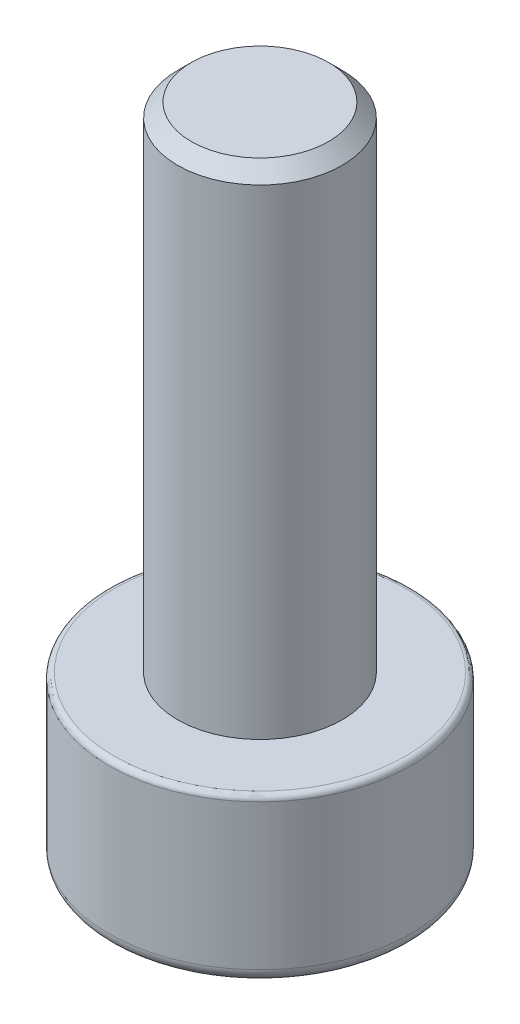
ISO-10303-21;
HEADER;
FILE_DESCRIPTION(('STEP AP214'),'2;1');
FILE_NAME('part.step','',(''),(''),'','','');
FILE_SCHEMA(('AUTOMOTIVE_DESIGN { 1 0 10303 214 1 1 1 1 }'));
ENDSEC;
DATA;
#1=APPLICATION_CONTEXT('core data for automotive mechanical design processes');
#2=APPLICATION_PROTOCOL_DEFINITION('international standard','automotive_design',2000,#1);
#3=PRODUCT_CONTEXT('',#1,'mechanical');
#4=PRODUCT('Part','Part','',(#3));
#5=PRODUCT_RELATED_PRODUCT_CATEGORY('part','',(#4));
#6=PRODUCT_DEFINITION_FORMATION('','',#4);
#7=PRODUCT_DEFINITION_CONTEXT('part definition',#1,'design');
#8=PRODUCT_DEFINITION('design','',#6,#7);
#9=PRODUCT_DEFINITION_SHAPE('','',#8);
#10=(LENGTH_UNIT() NAMED_UNIT(*) SI_UNIT(.MILLI.,.METRE.));
#11=(NAMED_UNIT(*) PLANE_ANGLE_UNIT() SI_UNIT($,.RADIAN.));
#12=(NAMED_UNIT(*) SI_UNIT($,.STERADIAN.) SOLID_ANGLE_UNIT());
#13=UNCERTAINTY_MEASURE_WITH_UNIT(LENGTH_MEASURE(1.E-05),#10,'distance_accuracy_value','');
#14=(GEOMETRIC_REPRESENTATION_CONTEXT(3) GLOBAL_UNCERTAINTY_ASSIGNED_CONTEXT((#13)) GLOBAL_UNIT_ASSIGNED_CONTEXT((#10,
#11,#12)) REPRESENTATION_CONTEXT('',''));
#15=CARTESIAN_POINT('',(0.,0.,0.));
#16=DIRECTION('',(0.,0.,1.));
#17=DIRECTION('',(1.,0.,0.));
#18=AXIS2_PLACEMENT_3D('',#15,#16,#17);
#19=CARTESIAN_POINT('',(0.,3.,0.));
#20=DIRECTION('',(0.,-1.,0.));
#21=DIRECTION('',(0.,0.,-1.));
#22=AXIS2_PLACEMENT_3D('',#19,#20,#21);
#23=CYLINDRICAL_SURFACE('',#22,2.75);
#24=CARTESIAN_POINT('',(0.,2.9,0.));
#25=DIRECTION('',(0.,1.,0.));
#26=DIRECTION('',(0.,0.,1.));
#27=AXIS2_PLACEMENT_3D('',#24,#25,#26);
#28=CIRCLE('',#27,2.75);
#29=CARTESIAN_POINT('',(0.,2.9,2.75));
#30=VERTEX_POINT('',#29);
#31=EDGE_CURVE('E11',#30,#30,#28,.F.);
#32=ORIENTED_EDGE('',*,*,#31,.T.);
#33=EDGE_LOOP('',(#32));
#34=FACE_BOUND('',#33,.T.);
#35=CARTESIAN_POINT('',(0.,0.25,0.));
#36=DIRECTION('',(0.,1.,0.));
#37=DIRECTION('',(0.,0.,1.));
#38=AXIS2_PLACEMENT_3D('',#35,#36,#37);
#39=CIRCLE('',#38,2.75);
#40=CARTESIAN_POINT('',(0.,0.25,2.75));
#41=VERTEX_POINT('',#40);
#42=EDGE_CURVE('E177',#41,#41,#39,.T.);
#43=ORIENTED_EDGE('',*,*,#42,.T.);
#44=EDGE_LOOP('',(#43));
#45=FACE_BOUND('',#44,.T.);
#46=ADVANCED_FACE('F33',(#34,#45),#23,.T.);
#47=CARTESIAN_POINT('',(0.,3.,0.));
#48=DIRECTION('',(0.,1.,0.));
#49=DIRECTION('',(0.,0.,1.));
#50=AXIS2_PLACEMENT_3D('',#47,#48,#49);
#51=PLANE('',#50);
#52=CARTESIAN_POINT('',(0.,3.,0.));
#53=DIRECTION('',(0.,1.,0.));
#54=DIRECTION('',(0.,0.,1.));
#55=AXIS2_PLACEMENT_3D('',#52,#53,#54);
#56=CIRCLE('',#55,2.65);
#57=CARTESIAN_POINT('',(0.,3.,2.65));
#58=VERTEX_POINT('',#57);
#59=EDGE_CURVE('E41',#58,#58,#56,.T.);
#60=ORIENTED_EDGE('',*,*,#59,.T.);
#61=EDGE_LOOP('',(#60));
#62=FACE_BOUND('',#61,.T.);
#63=CARTESIAN_POINT('',(0.,3.,0.));
#64=DIRECTION('',(0.,1.,0.));
#65=DIRECTION('',(0.,0.,1.));
#66=AXIS2_PLACEMENT_3D('',#63,#64,#65);
#67=CIRCLE('',#66,1.5);
#68=CARTESIAN_POINT('',(0.,3.,1.5));
#69=VERTEX_POINT('',#68);
#70=EDGE_CURVE('E141',#69,#69,#67,.T.);
#71=ORIENTED_EDGE('',*,*,#70,.F.);
#72=EDGE_LOOP('',(#71));
#73=FACE_BOUND('',#72,.T.);
#74=ADVANCED_FACE('F203',(#62,#73),#51,.T.);
#75=CARTESIAN_POINT('',(0.,0.,0.));
#76=DIRECTION('',(0.,1.,0.));
#77=DIRECTION('',(0.,0.,1.));
#78=AXIS2_PLACEMENT_3D('',#75,#76,#77);
#79=PLANE('',#78);
#80=CARTESIAN_POINT('',(0.,0.,0.));
#81=DIRECTION('',(0.,1.,0.));
#82=DIRECTION('',(0.,0.,1.));
#83=AXIS2_PLACEMENT_3D('',#80,#81,#82);
#84=CIRCLE('',#83,2.5);
#85=CARTESIAN_POINT('',(0.,0.,2.5));
#86=VERTEX_POINT('',#85);
#87=EDGE_CURVE('E192',#86,#86,#84,.F.);
#88=ORIENTED_EDGE('',*,*,#87,.T.);
#89=EDGE_LOOP('',(#88));
#90=FACE_BOUND('',#89,.T.);
#91=DIRECTION('',(-0.69197693122312,0.,-0.721919612321922));
#92=VECTOR('',#91,1.);
#93=CARTESIAN_POINT('',(1.02450088015783,0.,-0.982008194523007));
#94=LINE('',#93,#92);
#95=CARTESIAN_POINT('',(1.59146357561211,0.,-0.390512335578876));
#96=VERTEX_POINT('',#95);
#97=CARTESIAN_POINT('',(0.457538184703553,0.,-1.57350405346714));
#98=VERTEX_POINT('',#97);
#99=EDGE_CURVE('E156',#96,#98,#94,.T.);
#100=ORIENTED_EDGE('',*,*,#99,.T.);
#101=DIRECTION('',(-0.971189189372558,0.,0.238309795111058));
#102=VECTOR('',#101,1.);
#103=CARTESIAN_POINT('',(-0.3381936031025,0.,-1.3782478856777));
#104=LINE('',#103,#102);
#105=CARTESIAN_POINT('',(-1.13392539090855,0.,-1.18299171788826));
#106=VERTEX_POINT('',#105);
#107=EDGE_CURVE('E166',#98,#106,#104,.T.);
#108=ORIENTED_EDGE('',*,*,#107,.T.);
#109=DIRECTION('',(-0.279212258149438,0.,0.96022940743298));
#110=VECTOR('',#109,1.);
#111=CARTESIAN_POINT('',(-1.36269448326033,0.,-0.396239691154693));
#112=LINE('',#111,#110);
#113=CARTESIAN_POINT('',(-1.5914635756121,0.,0.390512335578876));
#114=VERTEX_POINT('',#113);
#115=EDGE_CURVE('E164',#106,#114,#112,.T.);
#116=ORIENTED_EDGE('',*,*,#115,.T.);
#117=DIRECTION('',(0.69197693122312,0.,0.721919612321922));
#118=VECTOR('',#117,1.);
#119=CARTESIAN_POINT('',(-1.02450088015783,0.,0.982008194523007));
#120=LINE('',#119,#118);
#121=CARTESIAN_POINT('',(-0.457538184703552,0.,1.57350405346714));
#122=VERTEX_POINT('',#121);
#123=EDGE_CURVE('E162',#114,#122,#120,.T.);
#124=ORIENTED_EDGE('',*,*,#123,.T.);
#125=DIRECTION('',(0.971189189372558,0.,-0.238309795111058));
#126=VECTOR('',#125,1.);
#127=CARTESIAN_POINT('',(0.3381936031025,0.,1.3782478856777));
#128=LINE('',#127,#126);
#129=CARTESIAN_POINT('',(1.13392539090855,0.,1.18299171788826));
#130=VERTEX_POINT('',#129);
#131=EDGE_CURVE('E160',#122,#130,#128,.T.);
#132=ORIENTED_EDGE('',*,*,#131,.T.);
#133=DIRECTION('',(0.279212258149438,0.,-0.96022940743298));
#134=VECTOR('',#133,1.);
#135=CARTESIAN_POINT('',(1.36269448326033,0.,0.396239691154693));
#136=LINE('',#135,#134);
#137=EDGE_CURVE('E158',#130,#96,#136,.T.);
#138=ORIENTED_EDGE('',*,*,#137,.T.);
#139=EDGE_LOOP('',(#100,#108,#116,#124,#132,#138));
#140=FACE_BOUND('',#139,.T.);
#141=ADVANCED_FACE('F221',(#90,#140),#79,.F.);
#142=CARTESIAN_POINT('',(0.,12.,0.));
#143=DIRECTION('',(0.,-1.,0.));
#144=DIRECTION('',(0.,0.,-1.));
#145=AXIS2_PLACEMENT_3D('',#142,#143,#144);
#146=CYLINDRICAL_SURFACE('',#145,1.5);
#147=CARTESIAN_POINT('',(0.,11.75,0.));
#148=DIRECTION('',(0.,1.,0.));
#149=DIRECTION('',(0.,0.,1.));
#150=AXIS2_PLACEMENT_3D('',#147,#148,#149);
#151=CIRCLE('',#150,1.5);
#152=CARTESIAN_POINT('',(0.,11.75,1.5));
#153=VERTEX_POINT('',#152);
#154=EDGE_CURVE('E198',#153,#153,#151,.F.);
#155=ORIENTED_EDGE('',*,*,#154,.T.);
#156=EDGE_LOOP('',(#155));
#157=FACE_BOUND('',#156,.T.);
#158=ORIENTED_EDGE('',*,*,#70,.T.);
#159=EDGE_LOOP('',(#158));
#160=FACE_BOUND('',#159,.T.);
#161=ADVANCED_FACE('F260',(#157,#160),#146,.T.);
#162=CARTESIAN_POINT('',(0.,12.,0.));
#163=DIRECTION('',(0.,1.,0.));
#164=DIRECTION('',(0.,0.,1.));
#165=AXIS2_PLACEMENT_3D('',#162,#163,#164);
#166=PLANE('',#165);
#167=CARTESIAN_POINT('',(0.,12.,0.));
#168=DIRECTION('',(0.,1.,0.));
#169=DIRECTION('',(0.,0.,1.));
#170=AXIS2_PLACEMENT_3D('',#167,#168,#169);
#171=CIRCLE('',#170,1.25);
#172=CARTESIAN_POINT('',(0.,12.,1.25));
#173=VERTEX_POINT('',#172);
#174=EDGE_CURVE('E195',#173,#173,#171,.T.);
#175=ORIENTED_EDGE('',*,*,#174,.T.);
#176=EDGE_LOOP('',(#175));
#177=FACE_BOUND('',#176,.T.);
#178=ADVANCED_FACE('F299',(#177),#166,.T.);
#179=CARTESIAN_POINT('',(1.31110540565295,1.5,-0.321718223399928));
#180=DIRECTION('',(0.96022940743298,0.,0.279212258149438));
#181=DIRECTION('',(0.279212258149438,0.,-0.96022940743298));
#182=AXIS2_PLACEMENT_3D('',#179,#180,#181);
#183=PLANE('',#182);
#184=DIRECTION('',(0.,-1.,0.));
#185=VECTOR('',#184,1.);
#186=CARTESIAN_POINT('',(1.31110540565295,1.5,-0.321718223399928));
#187=LINE('',#186,#185);
#188=CARTESIAN_POINT('',(1.31110540565295,1.5,-0.321718223399928));
#189=VERTEX_POINT('',#188);
#190=CARTESIAN_POINT('',(1.31110540565295,0.250000000000002,-0.321718223399928));
#191=VERTEX_POINT('',#190);
#192=EDGE_CURVE('E139',#189,#191,#187,.T.);
#193=ORIENTED_EDGE('',*,*,#192,.T.);
#194=DIRECTION('',(-0.279212258149438,0.,0.96022940743298));
#195=VECTOR('',#194,1.);
#196=CARTESIAN_POINT('',(1.31110540565295,0.250000000000002,-0.321718223399928));
#197=LINE('',#196,#195);
#198=CARTESIAN_POINT('',(0.934168857151212,0.250000000000002,0.974591476634595));
#199=VERTEX_POINT('',#198);
#200=EDGE_CURVE('E55',#191,#199,#197,.T.);
#201=ORIENTED_EDGE('',*,*,#200,.T.);
#202=DIRECTION('',(0.,-1.,0.));
#203=VECTOR('',#202,1.);
#204=CARTESIAN_POINT('',(0.934168857151212,1.5,0.974591476634595));
#205=LINE('',#204,#203);
#206=CARTESIAN_POINT('',(0.934168857151212,1.5,0.974591476634595));
#207=VERTEX_POINT('',#206);
#208=EDGE_CURVE('E103',#207,#199,#205,.T.);
#209=ORIENTED_EDGE('',*,*,#208,.F.);
#210=DIRECTION('',(-0.279212258149438,0.,0.96022940743298));
#211=VECTOR('',#210,1.);
#212=CARTESIAN_POINT('',(1.31110540565295,1.5,-0.321718223399928));
#213=LINE('',#212,#211);
#214=EDGE_CURVE('E107',#189,#207,#213,.T.);
#215=ORIENTED_EDGE('',*,*,#214,.F.);
#216=EDGE_LOOP('',(#193,#201,#209,#215));
#217=FACE_BOUND('',#216,.T.);
#218=ADVANCED_FACE('F105',(#217),#183,.F.);
#219=CARTESIAN_POINT('',(0.376936548501741,1.5,-1.29630970003452));
#220=DIRECTION('',(0.721919612321922,0.,-0.69197693122312));
#221=DIRECTION('',(-0.69197693122312,0.,-0.721919612321922));
#222=AXIS2_PLACEMENT_3D('',#219,#220,#221);
#223=PLANE('',#222);
#224=DIRECTION('',(0.,-1.,0.));
#225=VECTOR('',#224,1.);
#226=CARTESIAN_POINT('',(0.376936548501741,1.5,-1.29630970003452));
#227=LINE('',#226,#225);
#228=CARTESIAN_POINT('',(0.376936548501741,1.5,-1.29630970003452));
#229=VERTEX_POINT('',#228);
#230=CARTESIAN_POINT('',(0.376936548501741,0.250000000000002,-1.29630970003452));
#231=VERTEX_POINT('',#230);
#232=EDGE_CURVE('E142',#229,#231,#227,.T.);
#233=ORIENTED_EDGE('',*,*,#232,.T.);
#234=DIRECTION('',(0.69197693122312,0.,0.721919612321922));
#235=VECTOR('',#234,1.);
#236=CARTESIAN_POINT('',(0.376936548501741,0.250000000000002,-1.29630970003452));
#237=LINE('',#236,#235);
#238=EDGE_CURVE('E48',#231,#191,#237,.T.);
#239=ORIENTED_EDGE('',*,*,#238,.T.);
#240=ORIENTED_EDGE('',*,*,#192,.F.);
#241=DIRECTION('',(0.69197693122312,0.,0.721919612321922));
#242=VECTOR('',#241,1.);
#243=CARTESIAN_POINT('',(0.376936548501741,1.5,-1.29630970003452));
#244=LINE('',#243,#242);
#245=EDGE_CURVE('E112',#229,#189,#244,.T.);
#246=ORIENTED_EDGE('',*,*,#245,.F.);
#247=EDGE_LOOP('',(#233,#239,#240,#246));
#248=FACE_BOUND('',#247,.T.);
#249=ADVANCED_FACE('F272',(#248),#223,.F.);
#250=CARTESIAN_POINT('',(-0.934168857151211,1.5,-0.974591476634595));
#251=DIRECTION('',(-0.238309795111058,0.,-0.971189189372557));
#252=DIRECTION('',(-0.971189189372558,0.,0.238309795111058));
#253=AXIS2_PLACEMENT_3D('',#250,#251,#252);
#254=PLANE('',#253);
#255=DIRECTION('',(0.,-1.,0.));
#256=VECTOR('',#255,1.);
#257=CARTESIAN_POINT('',(-0.934168857151211,1.5,-0.974591476634595));
#258=LINE('',#257,#256);
#259=CARTESIAN_POINT('',(-0.934168857151211,1.5,-0.974591476634595));
#260=VERTEX_POINT('',#259);
#261=CARTESIAN_POINT('',(-0.934168857151211,0.250000000000002,-0.974591476634595));
#262=VERTEX_POINT('',#261);
#263=EDGE_CURVE('E144',#260,#262,#258,.T.);
#264=ORIENTED_EDGE('',*,*,#263,.T.);
#265=DIRECTION('',(0.971189189372558,0.,-0.238309795111058));
#266=VECTOR('',#265,1.);
#267=CARTESIAN_POINT('',(-0.934168857151211,0.250000000000002,-0.974591476634595));
#268=LINE('',#267,#266);
#269=EDGE_CURVE('E153',#262,#231,#268,.T.);
#270=ORIENTED_EDGE('',*,*,#269,.T.);
#271=ORIENTED_EDGE('',*,*,#232,.F.);
#272=DIRECTION('',(0.971189189372558,0.,-0.238309795111058));
#273=VECTOR('',#272,1.);
#274=CARTESIAN_POINT('',(-0.934168857151211,1.5,-0.974591476634595));
#275=LINE('',#274,#273);
#276=EDGE_CURVE('E136',#260,#229,#275,.T.);
#277=ORIENTED_EDGE('',*,*,#276,.F.);
#278=EDGE_LOOP('',(#264,#270,#271,#277));
#279=FACE_BOUND('',#278,.T.);
#280=ADVANCED_FACE('F270',(#279),#254,.F.);
#281=CARTESIAN_POINT('',(-1.31110540565295,1.5,0.321718223399928));
#282=DIRECTION('',(-0.96022940743298,0.,-0.279212258149438));
#283=DIRECTION('',(-0.279212258149438,0.,0.96022940743298));
#284=AXIS2_PLACEMENT_3D('',#281,#282,#283);
#285=PLANE('',#284);
#286=DIRECTION('',(0.,-1.,0.));
#287=VECTOR('',#286,1.);
#288=CARTESIAN_POINT('',(-1.31110540565295,1.5,0.321718223399928));
#289=LINE('',#288,#287);
#290=CARTESIAN_POINT('',(-1.31110540565295,1.5,0.321718223399928));
#291=VERTEX_POINT('',#290);
#292=CARTESIAN_POINT('',(-1.31110540565295,0.250000000000002,0.321718223399928));
#293=VERTEX_POINT('',#292);
#294=EDGE_CURVE('E147',#291,#293,#289,.T.);
#295=ORIENTED_EDGE('',*,*,#294,.T.);
#296=DIRECTION('',(0.279212258149438,0.,-0.96022940743298));
#297=VECTOR('',#296,1.);
#298=CARTESIAN_POINT('',(-1.31110540565295,0.250000000000002,0.321718223399928));
#299=LINE('',#298,#297);
#300=EDGE_CURVE('E169',#293,#262,#299,.T.);
#301=ORIENTED_EDGE('',*,*,#300,.T.);
#302=ORIENTED_EDGE('',*,*,#263,.F.);
#303=DIRECTION('',(0.279212258149438,0.,-0.96022940743298));
#304=VECTOR('',#303,1.);
#305=CARTESIAN_POINT('',(-1.31110540565295,1.5,0.321718223399928));
#306=LINE('',#305,#304);
#307=EDGE_CURVE('E133',#291,#260,#306,.T.);
#308=ORIENTED_EDGE('',*,*,#307,.F.);
#309=EDGE_LOOP('',(#295,#301,#302,#308));
#310=FACE_BOUND('',#309,.T.);
#311=ADVANCED_FACE('F281',(#310),#285,.F.);
#312=CARTESIAN_POINT('',(-0.376936548501741,1.5,1.29630970003452));
#313=DIRECTION('',(-0.721919612321922,0.,0.69197693122312));
#314=DIRECTION('',(0.69197693122312,0.,0.721919612321922));
#315=AXIS2_PLACEMENT_3D('',#312,#313,#314);
#316=PLANE('',#315);
#317=DIRECTION('',(0.,-1.,0.));
#318=VECTOR('',#317,1.);
#319=CARTESIAN_POINT('',(-0.376936548501741,1.5,1.29630970003452));
#320=LINE('',#319,#318);
#321=CARTESIAN_POINT('',(-0.376936548501741,1.5,1.29630970003452));
#322=VERTEX_POINT('',#321);
#323=CARTESIAN_POINT('',(-0.376936548501741,0.250000000000002,1.29630970003452));
#324=VERTEX_POINT('',#323);
#325=EDGE_CURVE('E111',#322,#324,#320,.T.);
#326=ORIENTED_EDGE('',*,*,#325,.T.);
#327=DIRECTION('',(-0.69197693122312,0.,-0.721919612321922));
#328=VECTOR('',#327,1.);
#329=CARTESIAN_POINT('',(-0.376936548501741,0.250000000000002,1.29630970003452));
#330=LINE('',#329,#328);
#331=EDGE_CURVE('E171',#324,#293,#330,.T.);
#332=ORIENTED_EDGE('',*,*,#331,.T.);
#333=ORIENTED_EDGE('',*,*,#294,.F.);
#334=DIRECTION('',(-0.69197693122312,0.,-0.721919612321922));
#335=VECTOR('',#334,1.);
#336=CARTESIAN_POINT('',(-0.376936548501741,1.5,1.29630970003452));
#337=LINE('',#336,#335);
#338=EDGE_CURVE('E121',#322,#291,#337,.T.);
#339=ORIENTED_EDGE('',*,*,#338,.F.);
#340=EDGE_LOOP('',(#326,#332,#333,#339));
#341=FACE_BOUND('',#340,.T.);
#342=ADVANCED_FACE('F278',(#341),#316,.F.);
#343=CARTESIAN_POINT('',(0.934168857151212,1.5,0.974591476634595));
#344=DIRECTION('',(0.238309795111058,0.,0.971189189372558));
#345=DIRECTION('',(0.971189189372558,0.,-0.238309795111058));
#346=AXIS2_PLACEMENT_3D('',#343,#344,#345);
#347=PLANE('',#346);
#348=ORIENTED_EDGE('',*,*,#208,.T.);
#349=DIRECTION('',(-0.971189189372558,0.,0.238309795111058));
#350=VECTOR('',#349,1.);
#351=CARTESIAN_POINT('',(0.934168857151212,0.250000000000002,0.974591476634595));
#352=LINE('',#351,#350);
#353=EDGE_CURVE('E173',#199,#324,#352,.T.);
#354=ORIENTED_EDGE('',*,*,#353,.T.);
#355=ORIENTED_EDGE('',*,*,#325,.F.);
#356=DIRECTION('',(-0.971189189372557,0.,0.238309795111058));
#357=VECTOR('',#356,1.);
#358=CARTESIAN_POINT('',(0.934168857151212,1.5,0.974591476634595));
#359=LINE('',#358,#357);
#360=EDGE_CURVE('E115',#207,#322,#359,.T.);
#361=ORIENTED_EDGE('',*,*,#360,.F.);
#362=EDGE_LOOP('',(#348,#354,#355,#361));
#363=FACE_BOUND('',#362,.T.);
#364=ADVANCED_FACE('F116',(#363),#347,.F.);
#365=CARTESIAN_POINT('',(0.,1.5,0.));
#366=DIRECTION('',(0.,-1.,0.));
#367=DIRECTION('',(0.,0.,-1.));
#368=AXIS2_PLACEMENT_3D('',#365,#366,#367);
#369=PLANE('',#368);
#370=ORIENTED_EDGE('',*,*,#214,.T.);
#371=ORIENTED_EDGE('',*,*,#360,.T.);
#372=ORIENTED_EDGE('',*,*,#338,.T.);
#373=ORIENTED_EDGE('',*,*,#307,.T.);
#374=ORIENTED_EDGE('',*,*,#276,.T.);
#375=ORIENTED_EDGE('',*,*,#245,.T.);
#376=EDGE_LOOP('',(#370,#371,#372,#373,#374,#375));
#377=FACE_BOUND('',#376,.T.);
#378=ADVANCED_FACE('F123',(#377),#369,.T.);
#379=CARTESIAN_POINT('',(0.934168857151212,0.250000000000002,0.974591476634595));
#380=DIRECTION('',(0.168510472146206,0.707106781186547,0.686734461620402));
#381=DIRECTION('',(-0.971189189372558,0.,0.238309795111058));
#382=AXIS2_PLACEMENT_3D('',#379,#380,#381);
#383=PLANE('',#382);
#384=DIRECTION('',(-0.523085392288577,0.654653670707978,-0.545719931652561));
#385=VECTOR('',#384,1.);
#386=CARTESIAN_POINT('',(0.934168857151212,0.250000000000002,0.974591476634595));
#387=LINE('',#386,#385);
#388=EDGE_CURVE('E129',#130,#199,#387,.T.);
#389=ORIENTED_EDGE('',*,*,#388,.F.);
#390=ORIENTED_EDGE('',*,*,#131,.F.);
#391=DIRECTION('',(0.211064628018337,0.654653670707978,-0.725865203896737));
#392=VECTOR('',#391,1.);
#393=CARTESIAN_POINT('',(-0.376936548501741,0.250000000000002,1.29630970003452));
#394=LINE('',#393,#392);
#395=EDGE_CURVE('E126',#324,#122,#394,.F.);
#396=ORIENTED_EDGE('',*,*,#395,.F.);
#397=ORIENTED_EDGE('',*,*,#353,.F.);
#398=EDGE_LOOP('',(#389,#390,#396,#397));
#399=FACE_BOUND('',#398,.T.);
#400=ADVANCED_FACE('F245',(#399),#383,.F.);
#401=CARTESIAN_POINT('',(-0.376936548501741,0.250000000000002,1.29630970003452));
#402=DIRECTION('',(-0.510474253344395,0.707106781186547,0.489301580492525));
#403=DIRECTION('',(-0.69197693122312,0.,-0.721919612321922));
#404=AXIS2_PLACEMENT_3D('',#401,#402,#403);
#405=PLANE('',#404);
#406=ORIENTED_EDGE('',*,*,#395,.T.);
#407=ORIENTED_EDGE('',*,*,#123,.F.);
#408=DIRECTION('',(0.734150020306914,0.654653670707978,-0.180145272244176));
#409=VECTOR('',#408,1.);
#410=CARTESIAN_POINT('',(-1.31110540565295,0.250000000000002,0.321718223399928));
#411=LINE('',#410,#409);
#412=EDGE_CURVE('E185',#293,#114,#411,.F.);
#413=ORIENTED_EDGE('',*,*,#412,.F.);
#414=ORIENTED_EDGE('',*,*,#331,.F.);
#415=EDGE_LOOP('',(#406,#407,#413,#414));
#416=FACE_BOUND('',#415,.T.);
#417=ADVANCED_FACE('F241',(#416),#405,.F.);
#418=CARTESIAN_POINT('',(1.31110540565295,0.250000000000002,-0.321718223399928));
#419=DIRECTION('',(0.678984725490601,0.707106781186547,0.197432881127877));
#420=DIRECTION('',(-0.279212258149438,0.,0.96022940743298));
#421=AXIS2_PLACEMENT_3D('',#418,#419,#420);
#422=PLANE('',#421);
#423=ORIENTED_EDGE('',*,*,#388,.T.);
#424=ORIENTED_EDGE('',*,*,#200,.F.);
#425=DIRECTION('',(-0.734150020306914,0.654653670707978,0.180145272244176));
#426=VECTOR('',#425,1.);
#427=CARTESIAN_POINT('',(1.31110540565295,0.250000000000002,-0.321718223399928));
#428=LINE('',#427,#426);
#429=EDGE_CURVE('E182',#96,#191,#428,.T.);
#430=ORIENTED_EDGE('',*,*,#429,.F.);
#431=ORIENTED_EDGE('',*,*,#137,.F.);
#432=EDGE_LOOP('',(#423,#424,#430,#431));
#433=FACE_BOUND('',#432,.T.);
#434=ADVANCED_FACE('F237',(#433),#422,.F.);
#435=CARTESIAN_POINT('',(-1.31110540565295,0.250000000000002,0.321718223399928));
#436=DIRECTION('',(-0.678984725490601,0.707106781186547,-0.197432881127877));
#437=DIRECTION('',(0.279212258149438,0.,-0.96022940743298));
#438=AXIS2_PLACEMENT_3D('',#435,#436,#437);
#439=PLANE('',#438);
#440=ORIENTED_EDGE('',*,*,#412,.T.);
#441=ORIENTED_EDGE('',*,*,#115,.F.);
#442=DIRECTION('',(0.523085392288577,0.654653670707978,0.545719931652561));
#443=VECTOR('',#442,1.);
#444=CARTESIAN_POINT('',(-0.934168857151211,0.250000000000002,-0.974591476634595));
#445=LINE('',#444,#443);
#446=EDGE_CURVE('E180',#262,#106,#445,.F.);
#447=ORIENTED_EDGE('',*,*,#446,.F.);
#448=ORIENTED_EDGE('',*,*,#300,.F.);
#449=EDGE_LOOP('',(#440,#441,#447,#448));
#450=FACE_BOUND('',#449,.T.);
#451=ADVANCED_FACE('F233',(#450),#439,.F.);
#452=CARTESIAN_POINT('',(0.376936548501741,0.250000000000002,-1.29630970003452));
#453=DIRECTION('',(0.510474253344395,0.707106781186547,-0.489301580492525));
#454=DIRECTION('',(0.69197693122312,0.,0.721919612321922));
#455=AXIS2_PLACEMENT_3D('',#452,#453,#454);
#456=PLANE('',#455);
#457=ORIENTED_EDGE('',*,*,#429,.T.);
#458=ORIENTED_EDGE('',*,*,#238,.F.);
#459=DIRECTION('',(0.211064628018338,-0.654653670707978,-0.725865203896737));
#460=VECTOR('',#459,1.);
#461=CARTESIAN_POINT('',(0.269240391786958,0.584038370031143,-0.92593550002466));
#462=LINE('',#461,#460);
#463=EDGE_CURVE('E178',#98,#231,#462,.F.);
#464=ORIENTED_EDGE('',*,*,#463,.F.);
#465=ORIENTED_EDGE('',*,*,#99,.F.);
#466=EDGE_LOOP('',(#457,#458,#464,#465));
#467=FACE_BOUND('',#466,.T.);
#468=ADVANCED_FACE('F229',(#467),#456,.F.);
#469=CARTESIAN_POINT('',(-0.934168857151211,0.250000000000002,-0.974591476634595));
#470=DIRECTION('',(-0.168510472146206,0.707106781186547,-0.686734461620402));
#471=DIRECTION('',(0.971189189372558,0.,-0.238309795111058));
#472=AXIS2_PLACEMENT_3D('',#469,#470,#471);
#473=PLANE('',#472);
#474=ORIENTED_EDGE('',*,*,#446,.T.);
#475=ORIENTED_EDGE('',*,*,#107,.F.);
#476=ORIENTED_EDGE('',*,*,#463,.T.);
#477=ORIENTED_EDGE('',*,*,#269,.F.);
#478=EDGE_LOOP('',(#474,#475,#476,#477));
#479=FACE_BOUND('',#478,.T.);
#480=ADVANCED_FACE('F226',(#479),#473,.F.);
#481=CARTESIAN_POINT('',(0.,0.25,0.));
#482=DIRECTION('',(0.,1.,0.));
#483=DIRECTION('',(0.,0.,1.));
#484=AXIS2_PLACEMENT_3D('',#481,#482,#483);
#485=TOROIDAL_SURFACE('',#484,2.5,0.25);
#486=ORIENTED_EDGE('',*,*,#87,.F.);
#487=EDGE_LOOP('',(#486));
#488=FACE_BOUND('',#487,.T.);
#489=ORIENTED_EDGE('',*,*,#42,.F.);
#490=EDGE_LOOP('',(#489));
#491=FACE_BOUND('',#490,.T.);
#492=ADVANCED_FACE('F212',(#488,#491),#485,.T.);
#493=CARTESIAN_POINT('',(0.,12.,0.));
#494=DIRECTION('',(0.,-1.,0.));
#495=DIRECTION('',(0.,0.,-1.));
#496=AXIS2_PLACEMENT_3D('',#493,#494,#495);
#497=CONICAL_SURFACE('',#496,1.25,0.785398163397443);
#498=ORIENTED_EDGE('',*,*,#154,.F.);
#499=EDGE_LOOP('',(#498));
#500=FACE_BOUND('',#499,.T.);
#501=ORIENTED_EDGE('',*,*,#174,.F.);
#502=EDGE_LOOP('',(#501));
#503=FACE_BOUND('',#502,.T.);
#504=ADVANCED_FACE('F207',(#500,#503),#497,.T.);
#505=CARTESIAN_POINT('',(0.,2.9,0.));
#506=DIRECTION('',(0.,1.,0.));
#507=DIRECTION('',(0.,0.,1.));
#508=AXIS2_PLACEMENT_3D('',#505,#506,#507);
#509=TOROIDAL_SURFACE('',#508,2.65,0.1);
#510=ORIENTED_EDGE('',*,*,#31,.F.);
#511=EDGE_LOOP('',(#510));
#512=FACE_BOUND('',#511,.T.);
#513=ORIENTED_EDGE('',*,*,#59,.F.);
#514=EDGE_LOOP('',(#513));
#515=FACE_BOUND('',#514,.T.);
#516=ADVANCED_FACE('F35',(#512,#515),#509,.T.);
#517=CLOSED_SHELL('',(#46,#74,#141,#161,#178,#218,#249,#280,#311,#342,#364,#378,#400,#417,#434,
#451,#468,#480,#492,#504,#516));
#518=MANIFOLD_SOLID_BREP('B2',#517);
#519=ADVANCED_BREP_SHAPE_REPRESENTATION('',(#18,#518),#14);
#520=SHAPE_DEFINITION_REPRESENTATION(#9,#519);
ENDSEC;
END-ISO-10303-21;
